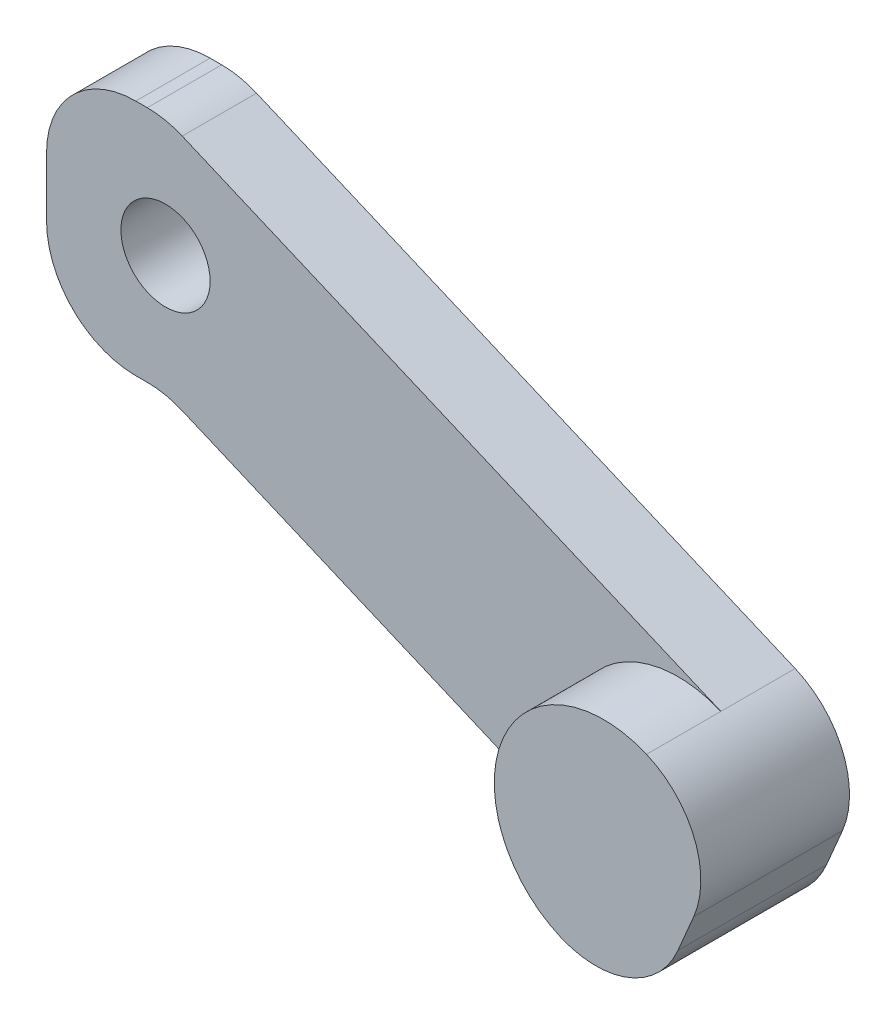
ISO-10303-21;
HEADER;
FILE_DESCRIPTION(('STEP AP214'),'2;1');
FILE_NAME('part.step','',(''),(''),'','','');
FILE_SCHEMA(('AUTOMOTIVE_DESIGN { 1 0 10303 214 1 1 1 1 }'));
ENDSEC;
DATA;
#1=APPLICATION_CONTEXT('core data for automotive mechanical design processes');
#2=APPLICATION_PROTOCOL_DEFINITION('international standard','automotive_design',2000,#1);
#3=PRODUCT_CONTEXT('',#1,'mechanical');
#4=PRODUCT('Part','Part','',(#3));
#5=PRODUCT_RELATED_PRODUCT_CATEGORY('part','',(#4));
#6=PRODUCT_DEFINITION_FORMATION('','',#4);
#7=PRODUCT_DEFINITION_CONTEXT('part definition',#1,'design');
#8=PRODUCT_DEFINITION('design','',#6,#7);
#9=PRODUCT_DEFINITION_SHAPE('','',#8);
#10=(LENGTH_UNIT() NAMED_UNIT(*) SI_UNIT(.MILLI.,.METRE.));
#11=(NAMED_UNIT(*) PLANE_ANGLE_UNIT() SI_UNIT($,.RADIAN.));
#12=(NAMED_UNIT(*) SI_UNIT($,.STERADIAN.) SOLID_ANGLE_UNIT());
#13=UNCERTAINTY_MEASURE_WITH_UNIT(LENGTH_MEASURE(1.E-05),#10,'distance_accuracy_value','');
#14=(GEOMETRIC_REPRESENTATION_CONTEXT(3) GLOBAL_UNCERTAINTY_ASSIGNED_CONTEXT((#13)) GLOBAL_UNIT_ASSIGNED_CONTEXT((#10,
#11,#12)) REPRESENTATION_CONTEXT('',''));
#15=CARTESIAN_POINT('',(0.,0.,0.));
#16=DIRECTION('',(0.,0.,1.));
#17=DIRECTION('',(1.,0.,0.));
#18=AXIS2_PLACEMENT_3D('',#15,#16,#17);
#19=CARTESIAN_POINT('',(0.,0.,5.));
#20=DIRECTION('',(0.,0.,-1.));
#21=DIRECTION('',(-1.,0.,0.));
#22=AXIS2_PLACEMENT_3D('',#19,#20,#21);
#23=PLANE('',#22);
#24=CARTESIAN_POINT('',(34.4780144892492,-14.6531561579309,5.));
#25=DIRECTION('',(0.,0.,1.));
#26=DIRECTION('',(1.,0.,0.));
#27=AXIS2_PLACEMENT_3D('',#24,#25,#26);
#28=CIRCLE('',#27,7.36264734766779);
#29=CARTESIAN_POINT('',(37.3578450874492,-7.87708416216594,5.));
#30=VERTEX_POINT('',#29);
#31=CARTESIAN_POINT('',(31.5981838910491,-21.4292281536958,5.));
#32=VERTEX_POINT('',#31);
#33=EDGE_CURVE('E171',#30,#32,#28,.T.);
#34=ORIENTED_EDGE('',*,*,#33,.F.);
#35=DIRECTION('',(0.920330918458474,-0.391140640344852,0.));
#36=VECTOR('',#35,1.);
#37=CARTESIAN_POINT('',(0.,8.,5.));
#38=LINE('',#37,#36);
#39=CARTESIAN_POINT('',(1.12473997470389,7.52198551075085,5.));
#40=VERTEX_POINT('',#39);
#41=EDGE_CURVE('E194',#40,#30,#38,.T.);
#42=ORIENTED_EDGE('',*,*,#41,.F.);
#43=CARTESIAN_POINT('',(-1.22210386736522,2.,5.));
#44=DIRECTION('',(0.,0.,-1.));
#45=DIRECTION('',(-1.,0.,0.));
#46=AXIS2_PLACEMENT_3D('',#43,#44,#45);
#47=CIRCLE('',#46,6.);
#48=CARTESIAN_POINT('',(-1.22210386736522,8.,5.));
#49=VERTEX_POINT('',#48);
#50=EDGE_CURVE('E69',#40,#49,#47,.F.);
#51=ORIENTED_EDGE('',*,*,#50,.T.);
#52=DIRECTION('',(1.,0.,0.));
#53=VECTOR('',#52,1.);
#54=CARTESIAN_POINT('',(-8.,8.,5.));
#55=LINE('',#54,#53);
#56=CARTESIAN_POINT('',(-2.,8.,5.));
#57=VERTEX_POINT('',#56);
#58=EDGE_CURVE('E191',#57,#49,#55,.T.);
#59=ORIENTED_EDGE('',*,*,#58,.F.);
#60=CARTESIAN_POINT('',(-2.,2.,5.));
#61=DIRECTION('',(0.,0.,-1.));
#62=DIRECTION('',(-1.,0.,0.));
#63=AXIS2_PLACEMENT_3D('',#60,#61,#62);
#64=CIRCLE('',#63,6.);
#65=CARTESIAN_POINT('',(-8.,2.,5.));
#66=VERTEX_POINT('',#65);
#67=EDGE_CURVE('E246',#57,#66,#64,.F.);
#68=ORIENTED_EDGE('',*,*,#67,.T.);
#69=DIRECTION('',(0.,1.,0.));
#70=VECTOR('',#69,1.);
#71=CARTESIAN_POINT('',(-8.,-8.,5.));
#72=LINE('',#71,#70);
#73=CARTESIAN_POINT('',(-8.,-2.,5.));
#74=VERTEX_POINT('',#73);
#75=EDGE_CURVE('E188',#74,#66,#72,.T.);
#76=ORIENTED_EDGE('',*,*,#75,.F.);
#77=CARTESIAN_POINT('',(-2.,-2.,5.));
#78=DIRECTION('',(0.,0.,-1.));
#79=DIRECTION('',(-1.,0.,0.));
#80=AXIS2_PLACEMENT_3D('',#77,#78,#79);
#81=CIRCLE('',#80,6.);
#82=CARTESIAN_POINT('',(-2.,-8.,5.));
#83=VERTEX_POINT('',#82);
#84=EDGE_CURVE('E248',#74,#83,#81,.F.);
#85=ORIENTED_EDGE('',*,*,#84,.T.);
#86=DIRECTION('',(-1.,0.,0.));
#87=VECTOR('',#86,1.);
#88=CARTESIAN_POINT('',(0.,-8.,5.));
#89=LINE('',#88,#87);
#90=CARTESIAN_POINT('',(-1.22210386736522,-8.,5.));
#91=VERTEX_POINT('',#90);
#92=EDGE_CURVE('E200',#91,#83,#89,.T.);
#93=ORIENTED_EDGE('',*,*,#92,.F.);
#94=CARTESIAN_POINT('',(-1.22210386736522,-14.,5.));
#95=DIRECTION('',(0.,0.,-1.));
#96=DIRECTION('',(-1.,0.,0.));
#97=AXIS2_PLACEMENT_3D('',#94,#95,#96);
#98=CIRCLE('',#97,6.);
#99=CARTESIAN_POINT('',(1.12473997470389,-8.47801448924915,5.));
#100=VERTEX_POINT('',#99);
#101=EDGE_CURVE('E12',#91,#100,#98,.T.);
#102=ORIENTED_EDGE('',*,*,#101,.T.);
#103=DIRECTION('',(-0.920330918458475,0.391140640344851,0.));
#104=VECTOR('',#103,1.);
#105=CARTESIAN_POINT('',(37.1201694017999,-23.7760719957649,5.));
#106=LINE('',#105,#104);
#107=EDGE_CURVE('E197',#32,#100,#106,.T.);
#108=ORIENTED_EDGE('',*,*,#107,.F.);
#109=EDGE_LOOP('',(#34,#42,#51,#59,#68,#76,#85,#93,#102,#108));
#110=FACE_BOUND('',#109,.T.);
#111=CARTESIAN_POINT('',(0.,0.,5.));
#112=DIRECTION('',(0.,0.,1.));
#113=DIRECTION('',(1.,0.,0.));
#114=AXIS2_PLACEMENT_3D('',#111,#112,#113);
#115=CIRCLE('',#114,3.);
#116=CARTESIAN_POINT('',(3.00000000000001,0.,5.));
#117=VERTEX_POINT('',#116);
#118=EDGE_CURVE('E180',#117,#117,#115,.T.);
#119=ORIENTED_EDGE('',*,*,#118,.F.);
#120=EDGE_LOOP('',(#119));
#121=FACE_BOUND('',#120,.T.);
#122=ADVANCED_FACE('F54',(#110,#121),#23,.F.);
#123=CARTESIAN_POINT('',(0.,0.,0.));
#124=DIRECTION('',(0.,0.,-1.));
#125=DIRECTION('',(-1.,0.,0.));
#126=AXIS2_PLACEMENT_3D('',#123,#124,#125);
#127=PLANE('',#126);
#128=DIRECTION('',(-1.,0.,0.));
#129=VECTOR('',#128,1.);
#130=CARTESIAN_POINT('',(0.,-8.,0.));
#131=LINE('',#130,#129);
#132=CARTESIAN_POINT('',(-1.22210386736522,-8.,0.));
#133=VERTEX_POINT('',#132);
#134=CARTESIAN_POINT('',(-2.,-8.,0.));
#135=VERTEX_POINT('',#134);
#136=EDGE_CURVE('E192',#133,#135,#131,.T.);
#137=ORIENTED_EDGE('',*,*,#136,.T.);
#138=CARTESIAN_POINT('',(-2.,-2.,0.));
#139=DIRECTION('',(0.,0.,-1.));
#140=DIRECTION('',(-1.,0.,0.));
#141=AXIS2_PLACEMENT_3D('',#138,#139,#140);
#142=CIRCLE('',#141,6.);
#143=CARTESIAN_POINT('',(-8.,-2.,0.));
#144=VERTEX_POINT('',#143);
#145=EDGE_CURVE('E238',#135,#144,#142,.T.);
#146=ORIENTED_EDGE('',*,*,#145,.T.);
#147=DIRECTION('',(0.,1.,0.));
#148=VECTOR('',#147,1.);
#149=CARTESIAN_POINT('',(-8.,-8.,0.));
#150=LINE('',#149,#148);
#151=CARTESIAN_POINT('',(-8.,2.,0.));
#152=VERTEX_POINT('',#151);
#153=EDGE_CURVE('E186',#144,#152,#150,.T.);
#154=ORIENTED_EDGE('',*,*,#153,.T.);
#155=CARTESIAN_POINT('',(-2.,2.,0.));
#156=DIRECTION('',(0.,0.,-1.));
#157=DIRECTION('',(-1.,0.,0.));
#158=AXIS2_PLACEMENT_3D('',#155,#156,#157);
#159=CIRCLE('',#158,6.);
#160=CARTESIAN_POINT('',(-2.,8.,0.));
#161=VERTEX_POINT('',#160);
#162=EDGE_CURVE('E236',#152,#161,#159,.T.);
#163=ORIENTED_EDGE('',*,*,#162,.T.);
#164=DIRECTION('',(1.,0.,0.));
#165=VECTOR('',#164,1.);
#166=CARTESIAN_POINT('',(-8.,8.,0.));
#167=LINE('',#166,#165);
#168=CARTESIAN_POINT('',(-1.22210386736522,8.,0.));
#169=VERTEX_POINT('',#168);
#170=EDGE_CURVE('E206',#161,#169,#167,.T.);
#171=ORIENTED_EDGE('',*,*,#170,.T.);
#172=CARTESIAN_POINT('',(-1.22210386736522,2.,0.));
#173=DIRECTION('',(0.,0.,-1.));
#174=DIRECTION('',(-1.,0.,0.));
#175=AXIS2_PLACEMENT_3D('',#172,#173,#174);
#176=CIRCLE('',#175,6.);
#177=CARTESIAN_POINT('',(1.12473997470389,7.52198551075085,0.));
#178=VERTEX_POINT('',#177);
#179=EDGE_CURVE('E234',#169,#178,#176,.T.);
#180=ORIENTED_EDGE('',*,*,#179,.T.);
#181=DIRECTION('',(0.920330918458474,-0.391140640344852,0.));
#182=VECTOR('',#181,1.);
#183=CARTESIAN_POINT('',(0.,8.,0.));
#184=LINE('',#183,#182);
#185=CARTESIAN_POINT('',(37.3578450874492,-7.87708416216594,0.));
#186=VERTEX_POINT('',#185);
#187=EDGE_CURVE('E209',#178,#186,#184,.T.);
#188=ORIENTED_EDGE('',*,*,#187,.T.);
#189=CARTESIAN_POINT('',(35.0110012453801,-13.3990696729168,0.));
#190=DIRECTION('',(0.,0.,-1.));
#191=DIRECTION('',(-1.,0.,0.));
#192=AXIS2_PLACEMENT_3D('',#189,#190,#191);
#193=CIRCLE('',#192,6.);
#194=CARTESIAN_POINT('',(40.532986756131,-15.7459135149859,0.));
#195=VERTEX_POINT('',#194);
#196=EDGE_CURVE('E232',#186,#195,#193,.T.);
#197=ORIENTED_EDGE('',*,*,#196,.T.);
#198=DIRECTION('',(-0.391140640344852,-0.920330918458475,0.));
#199=VECTOR('',#198,1.);
#200=CARTESIAN_POINT('',(42.8798305982001,-10.2239280042351,0.));
#201=LINE('',#200,#199);
#202=CARTESIAN_POINT('',(39.467013243869,-18.2540864850141,0.));
#203=VERTEX_POINT('',#202);
#204=EDGE_CURVE('E212',#195,#203,#201,.T.);
#205=ORIENTED_EDGE('',*,*,#204,.T.);
#206=CARTESIAN_POINT('',(33.9450277331182,-15.907242642945,0.));
#207=DIRECTION('',(0.,0.,-1.));
#208=DIRECTION('',(-1.,0.,0.));
#209=AXIS2_PLACEMENT_3D('',#206,#207,#208);
#210=CIRCLE('',#209,6.);
#211=CARTESIAN_POINT('',(31.5981838910491,-21.4292281536958,0.));
#212=VERTEX_POINT('',#211);
#213=EDGE_CURVE('E230',#203,#212,#210,.T.);
#214=ORIENTED_EDGE('',*,*,#213,.T.);
#215=DIRECTION('',(-0.920330918458475,0.391140640344851,0.));
#216=VECTOR('',#215,1.);
#217=CARTESIAN_POINT('',(37.1201694017999,-23.7760719957649,0.));
#218=LINE('',#217,#216);
#219=CARTESIAN_POINT('',(1.12473997470389,-8.47801448924915,0.));
#220=VERTEX_POINT('',#219);
#221=EDGE_CURVE('E215',#212,#220,#218,.T.);
#222=ORIENTED_EDGE('',*,*,#221,.T.);
#223=CARTESIAN_POINT('',(-1.22210386736522,-14.,0.));
#224=DIRECTION('',(0.,0.,-1.));
#225=DIRECTION('',(-1.,0.,0.));
#226=AXIS2_PLACEMENT_3D('',#223,#224,#225);
#227=CIRCLE('',#226,6.);
#228=EDGE_CURVE('E62',#220,#133,#227,.F.);
#229=ORIENTED_EDGE('',*,*,#228,.T.);
#230=EDGE_LOOP('',(#137,#146,#154,#163,#171,#180,#188,#197,#205,#214,#222,#229));
#231=FACE_BOUND('',#230,.T.);
#232=CARTESIAN_POINT('',(0.,0.,0.));
#233=DIRECTION('',(0.,0.,1.));
#234=DIRECTION('',(1.,0.,0.));
#235=AXIS2_PLACEMENT_3D('',#232,#233,#234);
#236=CIRCLE('',#235,3.);
#237=CARTESIAN_POINT('',(3.00000000000001,0.,0.));
#238=VERTEX_POINT('',#237);
#239=EDGE_CURVE('E177',#238,#238,#236,.T.);
#240=ORIENTED_EDGE('',*,*,#239,.T.);
#241=EDGE_LOOP('',(#240));
#242=FACE_BOUND('',#241,.T.);
#243=ADVANCED_FACE('F263',(#231,#242),#127,.T.);
#244=CARTESIAN_POINT('',(-8.,-8.,5.));
#245=DIRECTION('',(-1.,0.,0.));
#246=DIRECTION('',(0.,0.,1.));
#247=AXIS2_PLACEMENT_3D('',#244,#245,#246);
#248=PLANE('',#247);
#249=ORIENTED_EDGE('',*,*,#153,.F.);
#250=DIRECTION('',(0.,0.,-1.));
#251=VECTOR('',#250,1.);
#252=CARTESIAN_POINT('',(-8.,-2.,5.));
#253=LINE('',#252,#251);
#254=EDGE_CURVE('E243',#144,#74,#253,.F.);
#255=ORIENTED_EDGE('',*,*,#254,.T.);
#256=ORIENTED_EDGE('',*,*,#75,.T.);
#257=DIRECTION('',(0.,0.,-1.));
#258=VECTOR('',#257,1.);
#259=CARTESIAN_POINT('',(-8.,2.,5.));
#260=LINE('',#259,#258);
#261=EDGE_CURVE('E240',#66,#152,#260,.T.);
#262=ORIENTED_EDGE('',*,*,#261,.T.);
#263=EDGE_LOOP('',(#249,#255,#256,#262));
#264=FACE_BOUND('',#263,.T.);
#265=ADVANCED_FACE('F300',(#264),#248,.T.);
#266=CARTESIAN_POINT('',(0.,-8.,5.));
#267=DIRECTION('',(0.,-1.,0.));
#268=DIRECTION('',(0.,0.,-1.));
#269=AXIS2_PLACEMENT_3D('',#266,#267,#268);
#270=PLANE('',#269);
#271=ORIENTED_EDGE('',*,*,#136,.F.);
#272=DIRECTION('',(0.,0.,-1.));
#273=VECTOR('',#272,1.);
#274=CARTESIAN_POINT('',(-1.22210386736522,-8.,5.));
#275=LINE('',#274,#273);
#276=EDGE_CURVE('E228',#133,#91,#275,.F.);
#277=ORIENTED_EDGE('',*,*,#276,.T.);
#278=ORIENTED_EDGE('',*,*,#92,.T.);
#279=DIRECTION('',(0.,0.,-1.));
#280=VECTOR('',#279,1.);
#281=CARTESIAN_POINT('',(-2.,-8.,5.));
#282=LINE('',#281,#280);
#283=EDGE_CURVE('E225',#83,#135,#282,.T.);
#284=ORIENTED_EDGE('',*,*,#283,.T.);
#285=EDGE_LOOP('',(#271,#277,#278,#284));
#286=FACE_BOUND('',#285,.T.);
#287=ADVANCED_FACE('F270',(#286),#270,.T.);
#288=CARTESIAN_POINT('',(37.1201694017999,-23.7760719957649,5.));
#289=DIRECTION('',(-0.391140640344852,-0.920330918458475,0.));
#290=DIRECTION('',(0.920330918458475,-0.391140640344852,0.));
#291=AXIS2_PLACEMENT_3D('',#288,#289,#290);
#292=PLANE('',#291);
#293=ORIENTED_EDGE('',*,*,#107,.T.);
#294=DIRECTION('',(0.,0.,-1.));
#295=VECTOR('',#294,1.);
#296=CARTESIAN_POINT('',(1.12473997470389,-8.47801448924915,0.));
#297=LINE('',#296,#295);
#298=EDGE_CURVE('E222',#100,#220,#297,.T.);
#299=ORIENTED_EDGE('',*,*,#298,.T.);
#300=ORIENTED_EDGE('',*,*,#221,.F.);
#301=DIRECTION('',(0.,0.,-1.));
#302=VECTOR('',#301,1.);
#303=CARTESIAN_POINT('',(31.5981838910491,-21.4292281536958,5.));
#304=LINE('',#303,#302);
#305=EDGE_CURVE('E203',#212,#32,#304,.F.);
#306=ORIENTED_EDGE('',*,*,#305,.T.);
#307=EDGE_LOOP('',(#293,#299,#300,#306));
#308=FACE_BOUND('',#307,.T.);
#309=ADVANCED_FACE('F277',(#308),#292,.T.);
#310=CARTESIAN_POINT('',(42.8798305982001,-10.2239280042351,5.));
#311=DIRECTION('',(0.920330918458475,-0.391140640344852,0.));
#312=DIRECTION('',(0.391140640344852,0.920330918458475,0.));
#313=AXIS2_PLACEMENT_3D('',#310,#311,#312);
#314=PLANE('',#313);
#315=ORIENTED_EDGE('',*,*,#204,.F.);
#316=DIRECTION('',(0.,0.,-1.));
#317=VECTOR('',#316,1.);
#318=CARTESIAN_POINT('',(40.532986756131,-15.7459135149859,5.));
#319=LINE('',#318,#317);
#320=CARTESIAN_POINT('',(40.532986756131,-15.7459135149859,10.));
#321=VERTEX_POINT('',#320);
#322=EDGE_CURVE('E260',#195,#321,#319,.F.);
#323=ORIENTED_EDGE('',*,*,#322,.T.);
#324=DIRECTION('',(0.391140640344852,0.920330918458474,0.));
#325=VECTOR('',#324,1.);
#326=CARTESIAN_POINT('',(39.467013243869,-18.2540864850141,10.));
#327=LINE('',#326,#325);
#328=CARTESIAN_POINT('',(39.467013243869,-18.2540864850141,10.));
#329=VERTEX_POINT('',#328);
#330=EDGE_CURVE('E168',#329,#321,#327,.T.);
#331=ORIENTED_EDGE('',*,*,#330,.F.);
#332=DIRECTION('',(0.,0.,-1.));
#333=VECTOR('',#332,1.);
#334=CARTESIAN_POINT('',(39.467013243869,-18.2540864850141,5.));
#335=LINE('',#334,#333);
#336=EDGE_CURVE('E257',#329,#203,#335,.T.);
#337=ORIENTED_EDGE('',*,*,#336,.T.);
#338=EDGE_LOOP('',(#315,#323,#331,#337));
#339=FACE_BOUND('',#338,.T.);
#340=ADVANCED_FACE('F284',(#339),#314,.T.);
#341=CARTESIAN_POINT('',(0.,8.,5.));
#342=DIRECTION('',(0.391140640344852,0.920330918458474,0.));
#343=DIRECTION('',(-0.920330918458474,0.391140640344852,0.));
#344=AXIS2_PLACEMENT_3D('',#341,#342,#343);
#345=PLANE('',#344);
#346=ORIENTED_EDGE('',*,*,#187,.F.);
#347=DIRECTION('',(0.,0.,-1.));
#348=VECTOR('',#347,1.);
#349=CARTESIAN_POINT('',(1.12473997470389,7.52198551075085,5.));
#350=LINE('',#349,#348);
#351=EDGE_CURVE('E255',#178,#40,#350,.F.);
#352=ORIENTED_EDGE('',*,*,#351,.T.);
#353=ORIENTED_EDGE('',*,*,#41,.T.);
#354=DIRECTION('',(0.,0.,-1.));
#355=VECTOR('',#354,1.);
#356=CARTESIAN_POINT('',(37.3578450874492,-7.87708416216594,5.));
#357=LINE('',#356,#355);
#358=EDGE_CURVE('E176',#30,#186,#357,.T.);
#359=ORIENTED_EDGE('',*,*,#358,.T.);
#360=EDGE_LOOP('',(#346,#352,#353,#359));
#361=FACE_BOUND('',#360,.T.);
#362=ADVANCED_FACE('F287',(#361),#345,.T.);
#363=CARTESIAN_POINT('',(-8.,8.,5.));
#364=DIRECTION('',(0.,1.,0.));
#365=DIRECTION('',(0.,0.,1.));
#366=AXIS2_PLACEMENT_3D('',#363,#364,#365);
#367=PLANE('',#366);
#368=ORIENTED_EDGE('',*,*,#170,.F.);
#369=DIRECTION('',(0.,0.,-1.));
#370=VECTOR('',#369,1.);
#371=CARTESIAN_POINT('',(-2.,8.,5.));
#372=LINE('',#371,#370);
#373=EDGE_CURVE('E76',#161,#57,#372,.F.);
#374=ORIENTED_EDGE('',*,*,#373,.T.);
#375=ORIENTED_EDGE('',*,*,#58,.T.);
#376=DIRECTION('',(0.,0.,-1.));
#377=VECTOR('',#376,1.);
#378=CARTESIAN_POINT('',(-1.22210386736522,8.,5.));
#379=LINE('',#378,#377);
#380=EDGE_CURVE('E250',#49,#169,#379,.T.);
#381=ORIENTED_EDGE('',*,*,#380,.T.);
#382=EDGE_LOOP('',(#368,#374,#375,#381));
#383=FACE_BOUND('',#382,.T.);
#384=ADVANCED_FACE('F292',(#383),#367,.T.);
#385=CARTESIAN_POINT('',(0.,0.,5.));
#386=DIRECTION('',(0.,0.,-1.));
#387=DIRECTION('',(-1.,0.,0.));
#388=AXIS2_PLACEMENT_3D('',#385,#386,#387);
#389=CYLINDRICAL_SURFACE('',#388,3.);
#390=ORIENTED_EDGE('',*,*,#118,.T.);
#391=EDGE_LOOP('',(#390));
#392=FACE_BOUND('',#391,.T.);
#393=ORIENTED_EDGE('',*,*,#239,.F.);
#394=EDGE_LOOP('',(#393));
#395=FACE_BOUND('',#394,.T.);
#396=ADVANCED_FACE('F312',(#392,#395),#389,.F.);
#397=CARTESIAN_POINT('',(-1.22210386736522,-14.,5.));
#398=DIRECTION('',(0.,0.,1.));
#399=DIRECTION('',(1.,0.,0.));
#400=AXIS2_PLACEMENT_3D('',#397,#398,#399);
#401=CYLINDRICAL_SURFACE('',#400,6.);
#402=ORIENTED_EDGE('',*,*,#101,.F.);
#403=ORIENTED_EDGE('',*,*,#276,.F.);
#404=ORIENTED_EDGE('',*,*,#228,.F.);
#405=ORIENTED_EDGE('',*,*,#298,.F.);
#406=EDGE_LOOP('',(#402,#403,#404,#405));
#407=FACE_BOUND('',#406,.T.);
#408=ADVANCED_FACE('F274',(#407),#401,.F.);
#409=CARTESIAN_POINT('',(-2.,-2.,5.));
#410=DIRECTION('',(0.,0.,-1.));
#411=DIRECTION('',(-1.,0.,0.));
#412=AXIS2_PLACEMENT_3D('',#409,#410,#411);
#413=CYLINDRICAL_SURFACE('',#412,6.);
#414=ORIENTED_EDGE('',*,*,#84,.F.);
#415=ORIENTED_EDGE('',*,*,#254,.F.);
#416=ORIENTED_EDGE('',*,*,#145,.F.);
#417=ORIENTED_EDGE('',*,*,#283,.F.);
#418=EDGE_LOOP('',(#414,#415,#416,#417));
#419=FACE_BOUND('',#418,.T.);
#420=ADVANCED_FACE('F304',(#419),#413,.T.);
#421=CARTESIAN_POINT('',(-2.,2.,5.));
#422=DIRECTION('',(0.,0.,-1.));
#423=DIRECTION('',(-1.,0.,0.));
#424=AXIS2_PLACEMENT_3D('',#421,#422,#423);
#425=CYLINDRICAL_SURFACE('',#424,6.);
#426=ORIENTED_EDGE('',*,*,#67,.F.);
#427=ORIENTED_EDGE('',*,*,#373,.F.);
#428=ORIENTED_EDGE('',*,*,#162,.F.);
#429=ORIENTED_EDGE('',*,*,#261,.F.);
#430=EDGE_LOOP('',(#426,#427,#428,#429));
#431=FACE_BOUND('',#430,.T.);
#432=ADVANCED_FACE('F297',(#431),#425,.T.);
#433=CARTESIAN_POINT('',(-1.22210386736522,2.,5.));
#434=DIRECTION('',(0.,0.,-1.));
#435=DIRECTION('',(-1.,0.,0.));
#436=AXIS2_PLACEMENT_3D('',#433,#434,#435);
#437=CYLINDRICAL_SURFACE('',#436,6.);
#438=ORIENTED_EDGE('',*,*,#50,.F.);
#439=ORIENTED_EDGE('',*,*,#351,.F.);
#440=ORIENTED_EDGE('',*,*,#179,.F.);
#441=ORIENTED_EDGE('',*,*,#380,.F.);
#442=EDGE_LOOP('',(#438,#439,#440,#441));
#443=FACE_BOUND('',#442,.T.);
#444=ADVANCED_FACE('F291',(#443),#437,.T.);
#445=CARTESIAN_POINT('',(35.0110012453801,-13.3990696729168,5.));
#446=DIRECTION('',(0.,0.,-1.));
#447=DIRECTION('',(-1.,0.,0.));
#448=AXIS2_PLACEMENT_3D('',#445,#446,#447);
#449=CYLINDRICAL_SURFACE('',#448,6.);
#450=ORIENTED_EDGE('',*,*,#358,.F.);
#451=DIRECTION('',(0.,0.,-1.));
#452=VECTOR('',#451,1.);
#453=CARTESIAN_POINT('',(37.3578450874492,-7.87708416216593,10.));
#454=LINE('',#453,#452);
#455=CARTESIAN_POINT('',(37.3578450874492,-7.87708416216593,10.));
#456=VERTEX_POINT('',#455);
#457=EDGE_CURVE('E155',#456,#30,#454,.T.);
#458=ORIENTED_EDGE('',*,*,#457,.F.);
#459=CARTESIAN_POINT('',(35.0110012453801,-13.3990696729168,10.));
#460=DIRECTION('',(0.,0.,1.));
#461=DIRECTION('',(1.,0.,0.));
#462=AXIS2_PLACEMENT_3D('',#459,#460,#461);
#463=CIRCLE('',#462,6.00000000000001);
#464=EDGE_CURVE('E162',#321,#456,#463,.T.);
#465=ORIENTED_EDGE('',*,*,#464,.F.);
#466=ORIENTED_EDGE('',*,*,#322,.F.);
#467=ORIENTED_EDGE('',*,*,#196,.F.);
#468=EDGE_LOOP('',(#450,#458,#465,#466,#467));
#469=FACE_BOUND('',#468,.T.);
#470=ADVANCED_FACE('F174',(#469),#449,.T.);
#471=CARTESIAN_POINT('',(33.9450277331182,-15.907242642945,5.));
#472=DIRECTION('',(0.,0.,-1.));
#473=DIRECTION('',(-1.,0.,0.));
#474=AXIS2_PLACEMENT_3D('',#471,#472,#473);
#475=CYLINDRICAL_SURFACE('',#474,6.);
#476=ORIENTED_EDGE('',*,*,#336,.F.);
#477=CARTESIAN_POINT('',(33.9450277331182,-15.907242642945,10.));
#478=DIRECTION('',(0.,0.,1.));
#479=DIRECTION('',(1.,0.,0.));
#480=AXIS2_PLACEMENT_3D('',#477,#478,#479);
#481=CIRCLE('',#480,6.);
#482=CARTESIAN_POINT('',(31.5981838910491,-21.4292281536958,10.));
#483=VERTEX_POINT('',#482);
#484=EDGE_CURVE('E161',#483,#329,#481,.T.);
#485=ORIENTED_EDGE('',*,*,#484,.F.);
#486=DIRECTION('',(0.,0.,-1.));
#487=VECTOR('',#486,1.);
#488=CARTESIAN_POINT('',(31.5981838910491,-21.4292281536958,10.));
#489=LINE('',#488,#487);
#490=EDGE_CURVE('E157',#483,#32,#489,.T.);
#491=ORIENTED_EDGE('',*,*,#490,.T.);
#492=ORIENTED_EDGE('',*,*,#305,.F.);
#493=ORIENTED_EDGE('',*,*,#213,.F.);
#494=EDGE_LOOP('',(#476,#485,#491,#492,#493));
#495=FACE_BOUND('',#494,.T.);
#496=ADVANCED_FACE('F56',(#495),#475,.T.);
#497=CARTESIAN_POINT('',(34.4780144892492,-14.6531561579309,10.));
#498=DIRECTION('',(0.,0.,-1.));
#499=DIRECTION('',(-1.,0.,0.));
#500=AXIS2_PLACEMENT_3D('',#497,#498,#499);
#501=CYLINDRICAL_SURFACE('',#500,7.36264734766779);
#502=ORIENTED_EDGE('',*,*,#33,.T.);
#503=ORIENTED_EDGE('',*,*,#490,.F.);
#504=CARTESIAN_POINT('',(34.4780144892492,-14.6531561579309,10.));
#505=DIRECTION('',(0.,0.,1.));
#506=DIRECTION('',(1.,0.,0.));
#507=AXIS2_PLACEMENT_3D('',#504,#505,#506);
#508=CIRCLE('',#507,7.3626473476678);
#509=EDGE_CURVE('E150',#456,#483,#508,.T.);
#510=ORIENTED_EDGE('',*,*,#509,.F.);
#511=ORIENTED_EDGE('',*,*,#457,.T.);
#512=EDGE_LOOP('',(#502,#503,#510,#511));
#513=FACE_BOUND('',#512,.T.);
#514=ADVANCED_FACE('F153',(#513),#501,.T.);
#515=CARTESIAN_POINT('',(35.0110012453801,-13.3990696729168,10.));
#516=DIRECTION('',(0.,0.,1.));
#517=DIRECTION('',(1.,0.,0.));
#518=AXIS2_PLACEMENT_3D('',#515,#516,#517);
#519=PLANE('',#518);
#520=ORIENTED_EDGE('',*,*,#464,.T.);
#521=ORIENTED_EDGE('',*,*,#509,.T.);
#522=ORIENTED_EDGE('',*,*,#484,.T.);
#523=ORIENTED_EDGE('',*,*,#330,.T.);
#524=EDGE_LOOP('',(#520,#521,#522,#523));
#525=FACE_BOUND('',#524,.T.);
#526=ADVANCED_FACE('F166',(#525),#519,.T.);
#527=CLOSED_SHELL('',(#122,#243,#265,#287,#309,#340,#362,#384,#396,#408,#420,#432,#444,#470,
#496,#514,#526));
#528=MANIFOLD_SOLID_BREP('B2',#527);
#529=ADVANCED_BREP_SHAPE_REPRESENTATION('',(#18,#528),#14);
#530=SHAPE_DEFINITION_REPRESENTATION(#9,#529);
ENDSEC;
END-ISO-10303-21;
